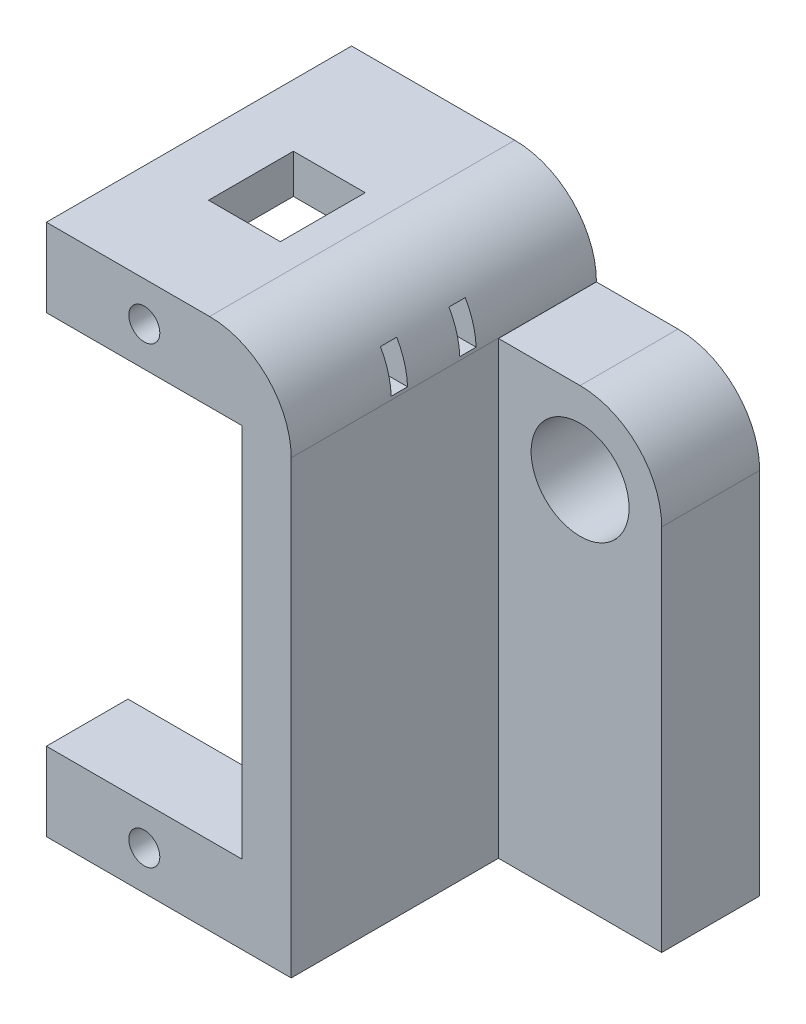
ISO-10303-21;
HEADER;
FILE_DESCRIPTION(('STEP AP214'),'2;1');
FILE_NAME('part.step','',(''),(''),'','','');
FILE_SCHEMA(('AUTOMOTIVE_DESIGN { 1 0 10303 214 1 1 1 1 }'));
ENDSEC;
DATA;
#1=APPLICATION_CONTEXT('core data for automotive mechanical design processes');
#2=APPLICATION_PROTOCOL_DEFINITION('international standard','automotive_design',2000,#1);
#3=PRODUCT_CONTEXT('',#1,'mechanical');
#4=PRODUCT('Part','Part','',(#3));
#5=PRODUCT_RELATED_PRODUCT_CATEGORY('part','',(#4));
#6=PRODUCT_DEFINITION_FORMATION('','',#4);
#7=PRODUCT_DEFINITION_CONTEXT('part definition',#1,'design');
#8=PRODUCT_DEFINITION('design','',#6,#7);
#9=PRODUCT_DEFINITION_SHAPE('','',#8);
#10=(LENGTH_UNIT() NAMED_UNIT(*) SI_UNIT(.MILLI.,.METRE.));
#11=(NAMED_UNIT(*) PLANE_ANGLE_UNIT() SI_UNIT($,.RADIAN.));
#12=(NAMED_UNIT(*) SI_UNIT($,.STERADIAN.) SOLID_ANGLE_UNIT());
#13=UNCERTAINTY_MEASURE_WITH_UNIT(LENGTH_MEASURE(1.E-05),#10,'distance_accuracy_value','');
#14=(GEOMETRIC_REPRESENTATION_CONTEXT(3) GLOBAL_UNCERTAINTY_ASSIGNED_CONTEXT((#13)) GLOBAL_UNIT_ASSIGNED_CONTEXT((#10,
#11,#12)) REPRESENTATION_CONTEXT('',''));
#15=CARTESIAN_POINT('',(0.,0.,0.));
#16=DIRECTION('',(0.,0.,1.));
#17=DIRECTION('',(1.,0.,0.));
#18=AXIS2_PLACEMENT_3D('',#15,#16,#17);
#19=CARTESIAN_POINT('',(19.0000000000061,0.,0.));
#20=DIRECTION('',(-1.,0.,0.));
#21=DIRECTION('',(0.,0.,1.));
#22=AXIS2_PLACEMENT_3D('',#19,#20,#21);
#23=PLANE('',#22);
#24=DIRECTION('',(0.,0.,1.));
#25=VECTOR('',#24,1.);
#26=CARTESIAN_POINT('',(19.0000000000061,-7.61690520008074,-19.7));
#27=LINE('',#26,#25);
#28=CARTESIAN_POINT('',(19.0000000000061,-7.61690520008074,-7.7));
#29=VERTEX_POINT('',#28);
#30=CARTESIAN_POINT('',(19.0000000000061,-7.61690520008077,-13.7));
#31=VERTEX_POINT('',#30);
#32=EDGE_CURVE('E49',#29,#31,#27,.F.);
#33=ORIENTED_EDGE('',*,*,#32,.F.);
#34=DIRECTION('',(0.,-1.,0.));
#35=VECTOR('',#34,1.);
#36=CARTESIAN_POINT('',(19.0000000000061,2.4000000000028,-7.7));
#37=LINE('',#36,#35);
#38=CARTESIAN_POINT('',(19.0000000000061,-30.1999999999972,-7.7));
#39=VERTEX_POINT('',#38);
#40=EDGE_CURVE('E440',#29,#39,#37,.T.);
#41=ORIENTED_EDGE('',*,*,#40,.T.);
#42=DIRECTION('',(0.,0.,-1.));
#43=VECTOR('',#42,1.);
#44=CARTESIAN_POINT('',(19.0000000000061,-30.1999999999972,-10.7));
#45=LINE('',#44,#43);
#46=CARTESIAN_POINT('',(19.0000000000061,-30.1999999999972,-13.7));
#47=VERTEX_POINT('',#46);
#48=EDGE_CURVE('E306',#39,#47,#45,.T.);
#49=ORIENTED_EDGE('',*,*,#48,.T.);
#50=DIRECTION('',(0.,-1.,0.));
#51=VECTOR('',#50,1.);
#52=CARTESIAN_POINT('',(19.0000000000061,-7.61690520008077,-13.7));
#53=LINE('',#52,#51);
#54=EDGE_CURVE('E304',#31,#47,#53,.T.);
#55=ORIENTED_EDGE('',*,*,#54,.F.);
#56=EDGE_LOOP('',(#33,#41,#49,#55));
#57=FACE_BOUND('',#56,.T.);
#58=ADVANCED_FACE('F41',(#57),#23,.F.);
#59=CARTESIAN_POINT('',(-5.99999999999394,2.4000000000028,0.));
#60=DIRECTION('',(0.,0.,-1.));
#61=DIRECTION('',(0.,1.,0.));
#62=AXIS2_PLACEMENT_3D('',#59,#60,#61);
#63=PLANE('',#62);
#64=DIRECTION('',(-1.,0.,0.));
#65=VECTOR('',#64,1.);
#66=CARTESIAN_POINT('',(6.00000000000606,0.,0.));
#67=LINE('',#66,#65);
#68=CARTESIAN_POINT('',(0.950000000000003,0.,0.));
#69=VERTEX_POINT('',#68);
#70=CARTESIAN_POINT('',(-0.950000000000003,0.,0.));
#71=VERTEX_POINT('',#70);
#72=EDGE_CURVE('E361',#69,#71,#67,.T.);
#73=ORIENTED_EDGE('',*,*,#72,.F.);
#74=CARTESIAN_POINT('',(0.,0.,0.));
#75=DIRECTION('',(0.,0.,1.));
#76=DIRECTION('',(1.,0.,0.));
#77=AXIS2_PLACEMENT_3D('',#74,#75,#76);
#78=CIRCLE('',#77,0.950000000000003);
#79=EDGE_CURVE('E269',#69,#71,#78,.T.);
#80=ORIENTED_EDGE('',*,*,#79,.T.);
#81=EDGE_LOOP('',(#73,#80));
#82=FACE_BOUND('',#81,.T.);
#83=ADVANCED_FACE('F494',(#82),#63,.F.);
#84=CARTESIAN_POINT('',(-2.2,-0.0999999999971974,-1.13455406858625));
#85=DIRECTION('',(0.,0.,1.));
#86=DIRECTION('',(1.,0.,0.));
#87=AXIS2_PLACEMENT_3D('',#84,#85,#86);
#88=PLANE('',#87);
#89=DIRECTION('',(0.,1.,0.));
#90=VECTOR('',#89,1.);
#91=CARTESIAN_POINT('',(2.2,-0.0999999999971974,-1.13455406858625));
#92=LINE('',#91,#90);
#93=CARTESIAN_POINT('',(2.2,0.,-1.13455406858625));
#94=VERTEX_POINT('',#93);
#95=CARTESIAN_POINT('',(2.2,2.4000000000028,-1.13455406858625));
#96=VERTEX_POINT('',#95);
#97=EDGE_CURVE('E429',#94,#96,#92,.T.);
#98=ORIENTED_EDGE('',*,*,#97,.F.);
#99=DIRECTION('',(-1.,0.,0.));
#100=VECTOR('',#99,1.);
#101=CARTESIAN_POINT('',(-2.2,0.,-1.13455406858625));
#102=LINE('',#101,#100);
#103=CARTESIAN_POINT('',(-2.2,0.,-1.13455406858625));
#104=VERTEX_POINT('',#103);
#105=EDGE_CURVE('E383',#94,#104,#102,.T.);
#106=ORIENTED_EDGE('',*,*,#105,.T.);
#107=DIRECTION('',(0.,1.,0.));
#108=VECTOR('',#107,1.);
#109=CARTESIAN_POINT('',(-2.2,-0.0999999999971974,-1.13455406858625));
#110=LINE('',#109,#108);
#111=CARTESIAN_POINT('',(-2.2,2.4000000000028,-1.13455406858625));
#112=VERTEX_POINT('',#111);
#113=EDGE_CURVE('E432',#104,#112,#110,.T.);
#114=ORIENTED_EDGE('',*,*,#113,.T.);
#115=DIRECTION('',(1.,0.,0.));
#116=VECTOR('',#115,1.);
#117=CARTESIAN_POINT('',(-2.2,2.4000000000028,-1.13455406858625));
#118=LINE('',#117,#116);
#119=EDGE_CURVE('E425',#112,#96,#118,.T.);
#120=ORIENTED_EDGE('',*,*,#119,.T.);
#121=EDGE_LOOP('',(#98,#106,#114,#120));
#122=FACE_BOUND('',#121,.T.);
#123=ADVANCED_FACE('F501',(#122),#88,.F.);
#124=CARTESIAN_POINT('',(-2.2,-0.0999999999971974,-6.33455406858625));
#125=DIRECTION('',(0.,0.,-1.));
#126=DIRECTION('',(-1.,0.,0.));
#127=AXIS2_PLACEMENT_3D('',#124,#125,#126);
#128=PLANE('',#127);
#129=DIRECTION('',(0.,1.,0.));
#130=VECTOR('',#129,1.);
#131=CARTESIAN_POINT('',(-2.2,-0.0999999999971974,-6.33455406858625));
#132=LINE('',#131,#130);
#133=CARTESIAN_POINT('',(-2.2,0.,-6.33455406858625));
#134=VERTEX_POINT('',#133);
#135=CARTESIAN_POINT('',(-2.2,2.4000000000028,-6.33455406858625));
#136=VERTEX_POINT('',#135);
#137=EDGE_CURVE('E434',#134,#136,#132,.T.);
#138=ORIENTED_EDGE('',*,*,#137,.F.);
#139=DIRECTION('',(1.,0.,0.));
#140=VECTOR('',#139,1.);
#141=CARTESIAN_POINT('',(-2.2,0.,-6.33455406858625));
#142=LINE('',#141,#140);
#143=CARTESIAN_POINT('',(2.2,0.,-6.33455406858625));
#144=VERTEX_POINT('',#143);
#145=EDGE_CURVE('E290',#134,#144,#142,.T.);
#146=ORIENTED_EDGE('',*,*,#145,.T.);
#147=DIRECTION('',(0.,1.,0.));
#148=VECTOR('',#147,1.);
#149=CARTESIAN_POINT('',(2.2,-0.0999999999971974,-6.33455406858625));
#150=LINE('',#149,#148);
#151=CARTESIAN_POINT('',(2.2,2.4000000000028,-6.33455406858625));
#152=VERTEX_POINT('',#151);
#153=EDGE_CURVE('E428',#144,#152,#150,.T.);
#154=ORIENTED_EDGE('',*,*,#153,.T.);
#155=DIRECTION('',(-1.,0.,0.));
#156=VECTOR('',#155,1.);
#157=CARTESIAN_POINT('',(-2.2,2.4000000000028,-6.33455406858625));
#158=LINE('',#157,#156);
#159=EDGE_CURVE('E419',#152,#136,#158,.T.);
#160=ORIENTED_EDGE('',*,*,#159,.T.);
#161=EDGE_LOOP('',(#138,#146,#154,#160));
#162=FACE_BOUND('',#161,.T.);
#163=ADVANCED_FACE('F603',(#162),#128,.F.);
#164=CARTESIAN_POINT('',(-5.99999999999394,-2.3999999999972,5.));
#165=DIRECTION('',(1.,0.,0.));
#166=DIRECTION('',(0.,0.,-1.));
#167=AXIS2_PLACEMENT_3D('',#164,#165,#166);
#168=PLANE('',#167);
#169=DIRECTION('',(0.,0.,-1.));
#170=VECTOR('',#169,1.);
#171=CARTESIAN_POINT('',(-5.99999999999394,2.4000000000028,5.));
#172=LINE('',#171,#170);
#173=CARTESIAN_POINT('',(-5.99999999999394,2.4000000000028,5.));
#174=VERTEX_POINT('',#173);
#175=CARTESIAN_POINT('',(-5.99999999999394,2.4000000000028,-13.7));
#176=VERTEX_POINT('',#175);
#177=EDGE_CURVE('E288',#174,#176,#172,.T.);
#178=ORIENTED_EDGE('',*,*,#177,.T.);
#179=DIRECTION('',(0.,1.,0.));
#180=VECTOR('',#179,1.);
#181=CARTESIAN_POINT('',(-5.99999999999394,0.,-13.7));
#182=LINE('',#181,#180);
#183=CARTESIAN_POINT('',(-5.99999999999394,0.,-13.7));
#184=VERTEX_POINT('',#183);
#185=EDGE_CURVE('E332',#184,#176,#182,.T.);
#186=ORIENTED_EDGE('',*,*,#185,.F.);
#187=DIRECTION('',(0.,0.,-1.));
#188=VECTOR('',#187,1.);
#189=CARTESIAN_POINT('',(-5.99999999999394,0.,-10.7));
#190=LINE('',#189,#188);
#191=CARTESIAN_POINT('',(-5.99999999999394,0.,0.));
#192=VERTEX_POINT('',#191);
#193=EDGE_CURVE('E352',#192,#184,#190,.T.);
#194=ORIENTED_EDGE('',*,*,#193,.F.);
#195=DIRECTION('',(0.,1.,0.));
#196=VECTOR('',#195,1.);
#197=CARTESIAN_POINT('',(-5.99999999999394,-2.3999999999972,0.));
#198=LINE('',#197,#196);
#199=CARTESIAN_POINT('',(-5.99999999999394,-2.3999999999972,0.));
#200=VERTEX_POINT('',#199);
#201=EDGE_CURVE('E346',#200,#192,#198,.T.);
#202=ORIENTED_EDGE('',*,*,#201,.F.);
#203=DIRECTION('',(0.,0.,-1.));
#204=VECTOR('',#203,1.);
#205=CARTESIAN_POINT('',(-5.99999999999394,-2.3999999999972,5.));
#206=LINE('',#205,#204);
#207=CARTESIAN_POINT('',(-5.99999999999394,-2.3999999999972,5.));
#208=VERTEX_POINT('',#207);
#209=EDGE_CURVE('E285',#208,#200,#206,.T.);
#210=ORIENTED_EDGE('',*,*,#209,.F.);
#211=DIRECTION('',(0.,-1.,0.));
#212=VECTOR('',#211,1.);
#213=CARTESIAN_POINT('',(-5.99999999999394,-2.3999999999972,5.));
#214=LINE('',#213,#212);
#215=EDGE_CURVE('E278',#174,#208,#214,.T.);
#216=ORIENTED_EDGE('',*,*,#215,.F.);
#217=EDGE_LOOP('',(#178,#186,#194,#202,#210,#216));
#218=FACE_BOUND('',#217,.T.);
#219=ADVANCED_FACE('F555',(#218),#168,.F.);
#220=CARTESIAN_POINT('',(6.00000000000606,-2.3999999999972,5.));
#221=DIRECTION('',(0.,1.,0.));
#222=DIRECTION('',(0.,0.,1.));
#223=AXIS2_PLACEMENT_3D('',#220,#221,#222);
#224=PLANE('',#223);
#225=ORIENTED_EDGE('',*,*,#209,.T.);
#226=DIRECTION('',(-1.,0.,0.));
#227=VECTOR('',#226,1.);
#228=CARTESIAN_POINT('',(6.00000000000606,-2.3999999999972,0.));
#229=LINE('',#228,#227);
#230=CARTESIAN_POINT('',(6.00000000000606,-2.3999999999972,0.));
#231=VERTEX_POINT('',#230);
#232=EDGE_CURVE('E354',#231,#200,#229,.T.);
#233=ORIENTED_EDGE('',*,*,#232,.F.);
#234=DIRECTION('',(0.,0.,-1.));
#235=VECTOR('',#234,1.);
#236=CARTESIAN_POINT('',(6.00000000000606,-2.3999999999972,5.));
#237=LINE('',#236,#235);
#238=CARTESIAN_POINT('',(6.00000000000606,-2.3999999999972,5.));
#239=VERTEX_POINT('',#238);
#240=EDGE_CURVE('E282',#239,#231,#237,.T.);
#241=ORIENTED_EDGE('',*,*,#240,.F.);
#242=DIRECTION('',(1.,0.,0.));
#243=VECTOR('',#242,1.);
#244=CARTESIAN_POINT('',(6.00000000000606,-2.3999999999972,5.));
#245=LINE('',#244,#243);
#246=EDGE_CURVE('E280',#208,#239,#245,.T.);
#247=ORIENTED_EDGE('',*,*,#246,.F.);
#248=EDGE_LOOP('',(#225,#233,#241,#247));
#249=FACE_BOUND('',#248,.T.);
#250=ADVANCED_FACE('F526',(#249),#224,.F.);
#251=CARTESIAN_POINT('',(9.00000000000606,0.,0.));
#252=DIRECTION('',(1.,0.,0.));
#253=DIRECTION('',(0.,0.,-1.));
#254=AXIS2_PLACEMENT_3D('',#251,#252,#253);
#255=PLANE('',#254);
#256=DIRECTION('',(0.,0.,1.));
#257=VECTOR('',#256,1.);
#258=CARTESIAN_POINT('',(9.00000000000605,-2.5999999999972,-18.));
#259=LINE('',#258,#257);
#260=CARTESIAN_POINT('',(9.00000000000606,-2.5999999999972,-13.7));
#261=VERTEX_POINT('',#260);
#262=CARTESIAN_POINT('',(9.00000000000605,-2.5999999999972,5.));
#263=VERTEX_POINT('',#262);
#264=EDGE_CURVE('E234',#261,#263,#259,.T.);
#265=ORIENTED_EDGE('',*,*,#264,.T.);
#266=DIRECTION('',(0.,-1.,0.));
#267=VECTOR('',#266,1.);
#268=CARTESIAN_POINT('',(9.00000000000606,2.4000000000028,5.));
#269=LINE('',#268,#267);
#270=CARTESIAN_POINT('',(9.00000000000606,-30.1999999999972,5.));
#271=VERTEX_POINT('',#270);
#272=EDGE_CURVE('E245',#263,#271,#269,.T.);
#273=ORIENTED_EDGE('',*,*,#272,.T.);
#274=DIRECTION('',(0.,0.,-1.));
#275=VECTOR('',#274,1.);
#276=CARTESIAN_POINT('',(9.00000000000606,-30.1999999999972,5.));
#277=LINE('',#276,#275);
#278=CARTESIAN_POINT('',(9.00000000000606,-30.1999999999972,-7.7));
#279=VERTEX_POINT('',#278);
#280=EDGE_CURVE('E255',#271,#279,#277,.T.);
#281=ORIENTED_EDGE('',*,*,#280,.T.);
#282=DIRECTION('',(0.,-1.,0.));
#283=VECTOR('',#282,1.);
#284=CARTESIAN_POINT('',(9.00000000000606,2.4000000000028,-7.7));
#285=LINE('',#284,#283);
#286=CARTESIAN_POINT('',(9.00000000000606,-2.61690520008074,-7.7));
#287=VERTEX_POINT('',#286);
#288=EDGE_CURVE('E439',#287,#279,#285,.T.);
#289=ORIENTED_EDGE('',*,*,#288,.F.);
#290=DIRECTION('',(0.,0.,1.));
#291=VECTOR('',#290,1.);
#292=CARTESIAN_POINT('',(9.00000000000606,-2.61690520008074,-19.7));
#293=LINE('',#292,#291);
#294=CARTESIAN_POINT('',(9.00000000000606,-2.61690520008074,-13.7));
#295=VERTEX_POINT('',#294);
#296=EDGE_CURVE('E343',#295,#287,#293,.T.);
#297=ORIENTED_EDGE('',*,*,#296,.F.);
#298=DIRECTION('',(0.,-1.,0.));
#299=VECTOR('',#298,1.);
#300=CARTESIAN_POINT('',(9.00000000000606,2.4000000000028,-13.7));
#301=LINE('',#300,#299);
#302=EDGE_CURVE('E248',#261,#295,#301,.T.);
#303=ORIENTED_EDGE('',*,*,#302,.F.);
#304=EDGE_LOOP('',(#265,#273,#281,#289,#297,#303));
#305=FACE_BOUND('',#304,.T.);
#306=ADVANCED_FACE('F243',(#305),#255,.T.);
#307=CARTESIAN_POINT('',(2.2,-0.0999999999971974,-6.33455406858625));
#308=DIRECTION('',(1.,0.,0.));
#309=DIRECTION('',(0.,0.,-1.));
#310=AXIS2_PLACEMENT_3D('',#307,#308,#309);
#311=PLANE('',#310);
#312=ORIENTED_EDGE('',*,*,#153,.F.);
#313=DIRECTION('',(0.,0.,1.));
#314=VECTOR('',#313,1.);
#315=CARTESIAN_POINT('',(2.2,0.,-6.33455406858625));
#316=LINE('',#315,#314);
#317=EDGE_CURVE('E380',#144,#94,#316,.T.);
#318=ORIENTED_EDGE('',*,*,#317,.T.);
#319=ORIENTED_EDGE('',*,*,#97,.T.);
#320=DIRECTION('',(0.,0.,-1.));
#321=VECTOR('',#320,1.);
#322=CARTESIAN_POINT('',(2.2,2.4000000000028,-6.33455406858625));
#323=LINE('',#322,#321);
#324=EDGE_CURVE('E416',#96,#152,#323,.T.);
#325=ORIENTED_EDGE('',*,*,#324,.T.);
#326=EDGE_LOOP('',(#312,#318,#319,#325));
#327=FACE_BOUND('',#326,.T.);
#328=ADVANCED_FACE('F525',(#327),#311,.F.);
#329=CARTESIAN_POINT('',(-2.2,-0.0999999999971974,-6.33455406858625));
#330=DIRECTION('',(-1.,0.,0.));
#331=DIRECTION('',(0.,0.,1.));
#332=AXIS2_PLACEMENT_3D('',#329,#330,#331);
#333=PLANE('',#332);
#334=ORIENTED_EDGE('',*,*,#113,.F.);
#335=DIRECTION('',(0.,0.,-1.));
#336=VECTOR('',#335,1.);
#337=CARTESIAN_POINT('',(-2.2,0.,-6.33455406858625));
#338=LINE('',#337,#336);
#339=EDGE_CURVE('E377',#104,#134,#338,.T.);
#340=ORIENTED_EDGE('',*,*,#339,.T.);
#341=ORIENTED_EDGE('',*,*,#137,.T.);
#342=DIRECTION('',(0.,0.,1.));
#343=VECTOR('',#342,1.);
#344=CARTESIAN_POINT('',(-2.2,2.4000000000028,-6.33455406858625));
#345=LINE('',#344,#343);
#346=EDGE_CURVE('E422',#136,#112,#345,.T.);
#347=ORIENTED_EDGE('',*,*,#346,.T.);
#348=EDGE_LOOP('',(#334,#340,#341,#347));
#349=FACE_BOUND('',#348,.T.);
#350=ADVANCED_FACE('F488',(#349),#333,.F.);
#351=CARTESIAN_POINT('',(6.00000000000606,0.,0.));
#352=DIRECTION('',(1.,0.,0.));
#353=DIRECTION('',(0.,0.,-1.));
#354=AXIS2_PLACEMENT_3D('',#351,#352,#353);
#355=PLANE('',#354);
#356=ORIENTED_EDGE('',*,*,#240,.T.);
#357=DIRECTION('',(0.,1.,0.));
#358=VECTOR('',#357,1.);
#359=CARTESIAN_POINT('',(6.00000000000606,-2.3999999999972,0.));
#360=LINE('',#359,#358);
#361=CARTESIAN_POINT('',(6.00000000000606,0.,0.));
#362=VERTEX_POINT('',#361);
#363=EDGE_CURVE('E348',#231,#362,#360,.T.);
#364=ORIENTED_EDGE('',*,*,#363,.T.);
#365=DIRECTION('',(0.,0.,-1.));
#366=VECTOR('',#365,1.);
#367=CARTESIAN_POINT('',(6.00000000000606,0.,-10.7));
#368=LINE('',#367,#366);
#369=CARTESIAN_POINT('',(6.00000000000606,0.,-13.7));
#370=VERTEX_POINT('',#369);
#371=EDGE_CURVE('E351',#362,#370,#368,.T.);
#372=ORIENTED_EDGE('',*,*,#371,.T.);
#373=DIRECTION('',(0.,1.,0.));
#374=VECTOR('',#373,1.);
#375=CARTESIAN_POINT('',(6.00000000000606,-30.1999999999972,-13.7));
#376=LINE('',#375,#374);
#377=CARTESIAN_POINT('',(6.00000000000606,-30.1999999999972,-13.7));
#378=VERTEX_POINT('',#377);
#379=EDGE_CURVE('E326',#378,#370,#376,.T.);
#380=ORIENTED_EDGE('',*,*,#379,.F.);
#381=DIRECTION('',(0.,0.,-1.));
#382=VECTOR('',#381,1.);
#383=CARTESIAN_POINT('',(6.00000000000606,-30.1999999999972,5.));
#384=LINE('',#383,#382);
#385=CARTESIAN_POINT('',(6.00000000000606,-30.1999999999972,0.));
#386=VERTEX_POINT('',#385);
#387=EDGE_CURVE('E256',#386,#378,#384,.T.);
#388=ORIENTED_EDGE('',*,*,#387,.F.);
#389=DIRECTION('',(0.,1.,0.));
#390=VECTOR('',#389,1.);
#391=CARTESIAN_POINT('',(6.00000000000606,-30.1999999999972,0.));
#392=LINE('',#391,#390);
#393=CARTESIAN_POINT('',(6.00000000000606,-25.3999999999972,0.));
#394=VERTEX_POINT('',#393);
#395=EDGE_CURVE('E465',#386,#394,#392,.T.);
#396=ORIENTED_EDGE('',*,*,#395,.T.);
#397=DIRECTION('',(0.,0.,-1.));
#398=VECTOR('',#397,1.);
#399=CARTESIAN_POINT('',(6.00000000000606,-25.3999999999972,5.));
#400=LINE('',#399,#398);
#401=CARTESIAN_POINT('',(6.00000000000606,-25.3999999999972,5.));
#402=VERTEX_POINT('',#401);
#403=EDGE_CURVE('E447',#402,#394,#400,.T.);
#404=ORIENTED_EDGE('',*,*,#403,.F.);
#405=DIRECTION('',(0.,-1.,0.));
#406=VECTOR('',#405,1.);
#407=CARTESIAN_POINT('',(6.00000000000606,2.4000000000028,5.));
#408=LINE('',#407,#406);
#409=EDGE_CURVE('E259',#239,#402,#408,.T.);
#410=ORIENTED_EDGE('',*,*,#409,.F.);
#411=EDGE_LOOP('',(#356,#364,#372,#380,#388,#396,#404,#410));
#412=FACE_BOUND('',#411,.T.);
#413=DIRECTION('',(0.,1.,0.));
#414=VECTOR('',#413,1.);
#415=CARTESIAN_POINT('',(6.00000000000606,-2.5999999999972,-5.33455406858625));
#416=LINE('',#415,#414);
#417=CARTESIAN_POINT('',(6.00000000000606,-2.3999999999972,-5.33455406858625));
#418=VERTEX_POINT('',#417);
#419=CARTESIAN_POINT('',(6.00000000000606,-0.0999999999971974,-5.33455406858625));
#420=VERTEX_POINT('',#419);
#421=EDGE_CURVE('E365',#418,#420,#416,.T.);
#422=ORIENTED_EDGE('',*,*,#421,.F.);
#423=DIRECTION('',(0.,0.,1.));
#424=VECTOR('',#423,1.);
#425=CARTESIAN_POINT('',(6.00000000000606,-2.3999999999972,0.));
#426=LINE('',#425,#424);
#427=CARTESIAN_POINT('',(6.00000000000606,-2.3999999999972,-6.33455406858625));
#428=VERTEX_POINT('',#427);
#429=EDGE_CURVE('E399',#428,#418,#426,.T.);
#430=ORIENTED_EDGE('',*,*,#429,.F.);
#431=DIRECTION('',(0.,-1.,0.));
#432=VECTOR('',#431,1.);
#433=CARTESIAN_POINT('',(6.00000000000606,-0.0999999999971974,-6.33455406858625));
#434=LINE('',#433,#432);
#435=CARTESIAN_POINT('',(6.00000000000606,-0.0999999999971974,-6.33455406858625));
#436=VERTEX_POINT('',#435);
#437=EDGE_CURVE('E368',#436,#428,#434,.T.);
#438=ORIENTED_EDGE('',*,*,#437,.F.);
#439=DIRECTION('',(0.,0.,1.));
#440=VECTOR('',#439,1.);
#441=CARTESIAN_POINT('',(6.00000000000606,-0.0999999999971974,-5.33455406858625));
#442=LINE('',#441,#440);
#443=EDGE_CURVE('E360',#436,#420,#442,.T.);
#444=ORIENTED_EDGE('',*,*,#443,.T.);
#445=EDGE_LOOP('',(#422,#430,#438,#444));
#446=FACE_BOUND('',#445,.T.);
#447=DIRECTION('',(0.,1.,0.));
#448=VECTOR('',#447,1.);
#449=CARTESIAN_POINT('',(6.00000000000606,-0.0999999999971974,-1.13455406858625));
#450=LINE('',#449,#448);
#451=CARTESIAN_POINT('',(6.00000000000606,-2.3999999999972,-1.13455406858625));
#452=VERTEX_POINT('',#451);
#453=CARTESIAN_POINT('',(6.00000000000606,-0.0999999999971974,-1.13455406858625));
#454=VERTEX_POINT('',#453);
#455=EDGE_CURVE('E374',#452,#454,#450,.T.);
#456=ORIENTED_EDGE('',*,*,#455,.F.);
#457=DIRECTION('',(0.,0.,1.));
#458=VECTOR('',#457,1.);
#459=CARTESIAN_POINT('',(6.00000000000606,-2.3999999999972,0.));
#460=LINE('',#459,#458);
#461=CARTESIAN_POINT('',(6.00000000000606,-2.3999999999972,-2.13455406858625));
#462=VERTEX_POINT('',#461);
#463=EDGE_CURVE('E413',#462,#452,#460,.T.);
#464=ORIENTED_EDGE('',*,*,#463,.F.);
#465=DIRECTION('',(0.,-1.,0.));
#466=VECTOR('',#465,1.);
#467=CARTESIAN_POINT('',(6.00000000000606,-2.5999999999972,-2.13455406858625));
#468=LINE('',#467,#466);
#469=CARTESIAN_POINT('',(6.00000000000606,-0.0999999999971974,-2.13455406858625));
#470=VERTEX_POINT('',#469);
#471=EDGE_CURVE('E372',#470,#462,#468,.T.);
#472=ORIENTED_EDGE('',*,*,#471,.F.);
#473=DIRECTION('',(0.,0.,1.));
#474=VECTOR('',#473,1.);
#475=CARTESIAN_POINT('',(6.00000000000606,-0.0999999999971974,-2.13455406858625));
#476=LINE('',#475,#474);
#477=EDGE_CURVE('E370',#470,#454,#476,.T.);
#478=ORIENTED_EDGE('',*,*,#477,.T.);
#479=EDGE_LOOP('',(#456,#464,#472,#478));
#480=FACE_BOUND('',#479,.T.);
#481=ADVANCED_FACE('F479',(#412,#446,#480),#355,.F.);
#482=CARTESIAN_POINT('',(0.,0.,5.));
#483=DIRECTION('',(0.,0.,1.));
#484=DIRECTION('',(1.,0.,0.));
#485=AXIS2_PLACEMENT_3D('',#482,#483,#484);
#486=PLANE('',#485);
#487=CARTESIAN_POINT('',(4.00000000000605,-2.5999999999972,5.));
#488=DIRECTION('',(0.,0.,-1.));
#489=DIRECTION('',(-1.,0.,0.));
#490=AXIS2_PLACEMENT_3D('',#487,#488,#489);
#491=CIRCLE('',#490,5.);
#492=CARTESIAN_POINT('',(4.00000000000605,2.4000000000028,5.));
#493=VERTEX_POINT('',#492);
#494=EDGE_CURVE('E231',#493,#263,#491,.T.);
#495=ORIENTED_EDGE('',*,*,#494,.F.);
#496=DIRECTION('',(-1.,0.,0.));
#497=VECTOR('',#496,1.);
#498=CARTESIAN_POINT('',(6.00000000000606,2.4000000000028,5.));
#499=LINE('',#498,#497);
#500=EDGE_CURVE('E273',#493,#174,#499,.T.);
#501=ORIENTED_EDGE('',*,*,#500,.T.);
#502=ORIENTED_EDGE('',*,*,#215,.T.);
#503=ORIENTED_EDGE('',*,*,#246,.T.);
#504=ORIENTED_EDGE('',*,*,#409,.T.);
#505=DIRECTION('',(-1.,0.,0.));
#506=VECTOR('',#505,1.);
#507=CARTESIAN_POINT('',(6.00000000000606,-25.3999999999972,5.));
#508=LINE('',#507,#506);
#509=CARTESIAN_POINT('',(-5.99999999999394,-25.3999999999972,5.));
#510=VERTEX_POINT('',#509);
#511=EDGE_CURVE('E461',#402,#510,#508,.T.);
#512=ORIENTED_EDGE('',*,*,#511,.T.);
#513=DIRECTION('',(0.,-1.,0.));
#514=VECTOR('',#513,1.);
#515=CARTESIAN_POINT('',(-5.99999999999394,-30.1999999999972,5.));
#516=LINE('',#515,#514);
#517=CARTESIAN_POINT('',(-5.99999999999394,-30.1999999999972,5.));
#518=VERTEX_POINT('',#517);
#519=EDGE_CURVE('E456',#510,#518,#516,.T.);
#520=ORIENTED_EDGE('',*,*,#519,.T.);
#521=DIRECTION('',(-1.,0.,0.));
#522=VECTOR('',#521,1.);
#523=CARTESIAN_POINT('',(9.00000000000606,-30.1999999999972,5.));
#524=LINE('',#523,#522);
#525=EDGE_CURVE('E254',#271,#518,#524,.T.);
#526=ORIENTED_EDGE('',*,*,#525,.F.);
#527=ORIENTED_EDGE('',*,*,#272,.F.);
#528=EDGE_LOOP('',(#495,#501,#502,#503,#504,#512,#520,#526,#527));
#529=FACE_BOUND('',#528,.T.);
#530=CARTESIAN_POINT('',(0.,0.,5.));
#531=DIRECTION('',(0.,0.,1.));
#532=DIRECTION('',(1.,0.,0.));
#533=AXIS2_PLACEMENT_3D('',#530,#531,#532);
#534=CIRCLE('',#533,0.950000000000003);
#535=CARTESIAN_POINT('',(0.950000000000003,0.,5.));
#536=VERTEX_POINT('',#535);
#537=EDGE_CURVE('E270',#536,#536,#534,.T.);
#538=ORIENTED_EDGE('',*,*,#537,.F.);
#539=EDGE_LOOP('',(#538));
#540=FACE_BOUND('',#539,.T.);
#541=CARTESIAN_POINT('',(0.,-27.7999999999925,5.));
#542=DIRECTION('',(0.,0.,1.));
#543=DIRECTION('',(1.,0.,0.));
#544=AXIS2_PLACEMENT_3D('',#541,#542,#543);
#545=CIRCLE('',#544,0.950000000000002);
#546=CARTESIAN_POINT('',(0.950000000000002,-27.7999999999925,5.));
#547=VERTEX_POINT('',#546);
#548=EDGE_CURVE('E262',#547,#547,#545,.T.);
#549=ORIENTED_EDGE('',*,*,#548,.F.);
#550=EDGE_LOOP('',(#549));
#551=FACE_BOUND('',#550,.T.);
#552=ADVANCED_FACE('F251',(#529,#540,#551),#486,.T.);
#553=CARTESIAN_POINT('',(6.00000000000606,2.4000000000028,5.));
#554=DIRECTION('',(0.,-1.,0.));
#555=DIRECTION('',(0.,0.,-1.));
#556=AXIS2_PLACEMENT_3D('',#553,#554,#555);
#557=PLANE('',#556);
#558=ORIENTED_EDGE('',*,*,#159,.F.);
#559=ORIENTED_EDGE('',*,*,#324,.F.);
#560=ORIENTED_EDGE('',*,*,#119,.F.);
#561=ORIENTED_EDGE('',*,*,#346,.F.);
#562=EDGE_LOOP('',(#558,#559,#560,#561));
#563=FACE_BOUND('',#562,.T.);
#564=ORIENTED_EDGE('',*,*,#500,.F.);
#565=DIRECTION('',(0.,0.,1.));
#566=VECTOR('',#565,1.);
#567=CARTESIAN_POINT('',(4.00000000000605,2.4000000000028,-18.));
#568=LINE('',#567,#566);
#569=CARTESIAN_POINT('',(4.00000000000605,2.4000000000028,-13.7));
#570=VERTEX_POINT('',#569);
#571=EDGE_CURVE('E236',#570,#493,#568,.T.);
#572=ORIENTED_EDGE('',*,*,#571,.F.);
#573=DIRECTION('',(1.,0.,0.));
#574=VECTOR('',#573,1.);
#575=CARTESIAN_POINT('',(-5.99999999999394,2.4000000000028,-13.7));
#576=LINE('',#575,#574);
#577=EDGE_CURVE('E335',#176,#570,#576,.T.);
#578=ORIENTED_EDGE('',*,*,#577,.F.);
#579=ORIENTED_EDGE('',*,*,#177,.F.);
#580=EDGE_LOOP('',(#564,#572,#578,#579));
#581=FACE_BOUND('',#580,.T.);
#582=ADVANCED_FACE('F43',(#563,#581),#557,.F.);
#583=CARTESIAN_POINT('',(0.,0.,5.));
#584=DIRECTION('',(0.,0.,-1.));
#585=DIRECTION('',(-1.,0.,0.));
#586=AXIS2_PLACEMENT_3D('',#583,#584,#585);
#587=CYLINDRICAL_SURFACE('',#586,0.950000000000003);
#588=ORIENTED_EDGE('',*,*,#537,.T.);
#589=EDGE_LOOP('',(#588));
#590=FACE_BOUND('',#589,.T.);
#591=ORIENTED_EDGE('',*,*,#79,.F.);
#592=EDGE_CURVE('E276',#71,#69,#78,.T.);
#593=ORIENTED_EDGE('',*,*,#592,.F.);
#594=EDGE_LOOP('',(#591,#593));
#595=FACE_BOUND('',#594,.T.);
#596=ADVANCED_FACE('F485',(#590,#595),#587,.F.);
#597=CARTESIAN_POINT('',(9.00000000000606,-30.1999999999972,5.));
#598=DIRECTION('',(0.,1.,0.));
#599=DIRECTION('',(0.,0.,1.));
#600=AXIS2_PLACEMENT_3D('',#597,#598,#599);
#601=PLANE('',#600);
#602=ORIENTED_EDGE('',*,*,#525,.T.);
#603=DIRECTION('',(0.,0.,-1.));
#604=VECTOR('',#603,1.);
#605=CARTESIAN_POINT('',(-5.99999999999394,-30.1999999999972,5.));
#606=LINE('',#605,#604);
#607=CARTESIAN_POINT('',(-5.99999999999394,-30.1999999999972,0.));
#608=VERTEX_POINT('',#607);
#609=EDGE_CURVE('E453',#518,#608,#606,.T.);
#610=ORIENTED_EDGE('',*,*,#609,.T.);
#611=DIRECTION('',(1.,0.,0.));
#612=VECTOR('',#611,1.);
#613=CARTESIAN_POINT('',(6.00000000000606,-30.1999999999972,0.));
#614=LINE('',#613,#612);
#615=EDGE_CURVE('E457',#608,#386,#614,.T.);
#616=ORIENTED_EDGE('',*,*,#615,.T.);
#617=ORIENTED_EDGE('',*,*,#387,.T.);
#618=DIRECTION('',(-1.,0.,0.));
#619=VECTOR('',#618,1.);
#620=CARTESIAN_POINT('',(19.0000000000061,-30.1999999999972,-13.7));
#621=LINE('',#620,#619);
#622=EDGE_CURVE('E310',#47,#378,#621,.T.);
#623=ORIENTED_EDGE('',*,*,#622,.F.);
#624=ORIENTED_EDGE('',*,*,#48,.F.);
#625=DIRECTION('',(-1.,0.,0.));
#626=VECTOR('',#625,1.);
#627=CARTESIAN_POINT('',(19.0000000000061,-30.1999999999972,-7.7));
#628=LINE('',#627,#626);
#629=EDGE_CURVE('E443',#39,#279,#628,.T.);
#630=ORIENTED_EDGE('',*,*,#629,.T.);
#631=ORIENTED_EDGE('',*,*,#280,.F.);
#632=EDGE_LOOP('',(#602,#610,#616,#617,#623,#624,#630,#631));
#633=FACE_BOUND('',#632,.T.);
#634=ADVANCED_FACE('F521',(#633),#601,.F.);
#635=CARTESIAN_POINT('',(0.,0.,0.));
#636=DIRECTION('',(0.,0.,1.));
#637=DIRECTION('',(1.,0.,0.));
#638=AXIS2_PLACEMENT_3D('',#635,#636,#637);
#639=PLANE('',#638);
#640=ORIENTED_EDGE('',*,*,#395,.F.);
#641=ORIENTED_EDGE('',*,*,#615,.F.);
#642=DIRECTION('',(0.,-1.,0.));
#643=VECTOR('',#642,1.);
#644=CARTESIAN_POINT('',(-5.99999999999394,-30.1999999999972,0.));
#645=LINE('',#644,#643);
#646=CARTESIAN_POINT('',(-5.99999999999394,-25.3999999999972,0.));
#647=VERTEX_POINT('',#646);
#648=EDGE_CURVE('E460',#647,#608,#645,.T.);
#649=ORIENTED_EDGE('',*,*,#648,.F.);
#650=DIRECTION('',(-1.,0.,0.));
#651=VECTOR('',#650,1.);
#652=CARTESIAN_POINT('',(6.00000000000606,-25.3999999999972,0.));
#653=LINE('',#652,#651);
#654=EDGE_CURVE('E463',#394,#647,#653,.T.);
#655=ORIENTED_EDGE('',*,*,#654,.F.);
#656=EDGE_LOOP('',(#640,#641,#649,#655));
#657=FACE_BOUND('',#656,.T.);
#658=CARTESIAN_POINT('',(0.,-27.7999999999925,0.));
#659=DIRECTION('',(0.,0.,1.));
#660=DIRECTION('',(1.,0.,0.));
#661=AXIS2_PLACEMENT_3D('',#658,#659,#660);
#662=CIRCLE('',#661,0.950000000000002);
#663=CARTESIAN_POINT('',(0.950000000000002,-27.7999999999925,0.));
#664=VERTEX_POINT('',#663);
#665=EDGE_CURVE('E266',#664,#664,#662,.T.);
#666=ORIENTED_EDGE('',*,*,#665,.T.);
#667=EDGE_LOOP('',(#666));
#668=FACE_BOUND('',#667,.T.);
#669=ADVANCED_FACE('F514',(#657,#668),#639,.F.);
#670=CARTESIAN_POINT('',(6.00000000000606,-25.3999999999972,5.));
#671=DIRECTION('',(0.,-1.,0.));
#672=DIRECTION('',(0.,0.,-1.));
#673=AXIS2_PLACEMENT_3D('',#670,#671,#672);
#674=PLANE('',#673);
#675=ORIENTED_EDGE('',*,*,#654,.T.);
#676=DIRECTION('',(0.,0.,-1.));
#677=VECTOR('',#676,1.);
#678=CARTESIAN_POINT('',(-5.99999999999394,-25.3999999999972,5.));
#679=LINE('',#678,#677);
#680=EDGE_CURVE('E450',#510,#647,#679,.T.);
#681=ORIENTED_EDGE('',*,*,#680,.F.);
#682=ORIENTED_EDGE('',*,*,#511,.F.);
#683=ORIENTED_EDGE('',*,*,#403,.T.);
#684=EDGE_LOOP('',(#675,#681,#682,#683));
#685=FACE_BOUND('',#684,.T.);
#686=ADVANCED_FACE('F510',(#685),#674,.F.);
#687=CARTESIAN_POINT('',(-5.99999999999394,-30.1999999999972,5.));
#688=DIRECTION('',(1.,0.,0.));
#689=DIRECTION('',(0.,0.,-1.));
#690=AXIS2_PLACEMENT_3D('',#687,#688,#689);
#691=PLANE('',#690);
#692=ORIENTED_EDGE('',*,*,#648,.T.);
#693=ORIENTED_EDGE('',*,*,#609,.F.);
#694=ORIENTED_EDGE('',*,*,#519,.F.);
#695=ORIENTED_EDGE('',*,*,#680,.T.);
#696=EDGE_LOOP('',(#692,#693,#694,#695));
#697=FACE_BOUND('',#696,.T.);
#698=ADVANCED_FACE('F513',(#697),#691,.F.);
#699=CARTESIAN_POINT('',(0.,-27.7999999999925,5.));
#700=DIRECTION('',(0.,0.,-1.));
#701=DIRECTION('',(-1.,0.,0.));
#702=AXIS2_PLACEMENT_3D('',#699,#700,#701);
#703=CYLINDRICAL_SURFACE('',#702,0.950000000000002);
#704=ORIENTED_EDGE('',*,*,#548,.T.);
#705=EDGE_LOOP('',(#704));
#706=FACE_BOUND('',#705,.T.);
#707=ORIENTED_EDGE('',*,*,#665,.F.);
#708=EDGE_LOOP('',(#707));
#709=FACE_BOUND('',#708,.T.);
#710=ADVANCED_FACE('F475',(#706,#709),#703,.F.);
#711=CARTESIAN_POINT('',(19.0000000000061,2.4000000000028,-7.7));
#712=DIRECTION('',(0.,0.,-1.));
#713=DIRECTION('',(0.,1.,0.));
#714=AXIS2_PLACEMENT_3D('',#711,#712,#713);
#715=PLANE('',#714);
#716=CARTESIAN_POINT('',(14.0000000000061,-7.61690520008074,-7.7));
#717=DIRECTION('',(0.,0.,1.));
#718=DIRECTION('',(1.,0.,0.));
#719=AXIS2_PLACEMENT_3D('',#716,#717,#718);
#720=CIRCLE('',#719,3.);
#721=CARTESIAN_POINT('',(17.0000000000061,-7.61690520008074,-7.7));
#722=VERTEX_POINT('',#721);
#723=EDGE_CURVE('E431',#722,#722,#720,.T.);
#724=ORIENTED_EDGE('',*,*,#723,.F.);
#725=EDGE_LOOP('',(#724));
#726=FACE_BOUND('',#725,.T.);
#727=ORIENTED_EDGE('',*,*,#40,.F.);
#728=CARTESIAN_POINT('',(14.0000000000061,-7.61690520008074,-7.7));
#729=DIRECTION('',(0.,0.,-1.));
#730=DIRECTION('',(1.,0.,0.));
#731=AXIS2_PLACEMENT_3D('',#728,#729,#730);
#732=CIRCLE('',#731,5.);
#733=CARTESIAN_POINT('',(14.0000000000061,-2.61690520008074,-7.7));
#734=VERTEX_POINT('',#733);
#735=EDGE_CURVE('E300',#734,#29,#732,.T.);
#736=ORIENTED_EDGE('',*,*,#735,.F.);
#737=DIRECTION('',(1.,0.,0.));
#738=VECTOR('',#737,1.);
#739=CARTESIAN_POINT('',(14.0000000000061,-2.61690520008074,-7.7));
#740=LINE('',#739,#738);
#741=EDGE_CURVE('E340',#287,#734,#740,.T.);
#742=ORIENTED_EDGE('',*,*,#741,.F.);
#743=ORIENTED_EDGE('',*,*,#288,.T.);
#744=ORIENTED_EDGE('',*,*,#629,.F.);
#745=EDGE_LOOP('',(#727,#736,#742,#743,#744));
#746=FACE_BOUND('',#745,.T.);
#747=ADVANCED_FACE('F507',(#726,#746),#715,.F.);
#748=CARTESIAN_POINT('',(14.0000000000061,-7.61690520008074,-10.7));
#749=DIRECTION('',(0.,0.,1.));
#750=DIRECTION('',(1.,0.,0.));
#751=AXIS2_PLACEMENT_3D('',#748,#749,#750);
#752=CYLINDRICAL_SURFACE('',#751,3.);
#753=ORIENTED_EDGE('',*,*,#723,.T.);
#754=EDGE_LOOP('',(#753));
#755=FACE_BOUND('',#754,.T.);
#756=CARTESIAN_POINT('',(14.0000000000061,-7.61690520008074,-13.7));
#757=DIRECTION('',(0.,0.,-1.));
#758=DIRECTION('',(0.,1.,0.));
#759=AXIS2_PLACEMENT_3D('',#756,#757,#758);
#760=CIRCLE('',#759,3.);
#761=CARTESIAN_POINT('',(14.0000000000061,-4.61690520008073,-13.7));
#762=VERTEX_POINT('',#761);
#763=EDGE_CURVE('E318',#762,#762,#760,.T.);
#764=ORIENTED_EDGE('',*,*,#763,.T.);
#765=EDGE_LOOP('',(#764));
#766=FACE_BOUND('',#765,.T.);
#767=ADVANCED_FACE('F506',(#755,#766),#752,.F.);
#768=DIRECTION('',(1.,0.,0.));
#769=VECTOR('',#768,1.);
#770=CARTESIAN_POINT('',(-10.3,-0.0999999999971974,-1.13455406858625));
#771=LINE('',#770,#769);
#772=CARTESIAN_POINT('',(8.33012701892825,-0.0999999999971974,-1.13455406858625));
#773=VERTEX_POINT('',#772);
#774=EDGE_CURVE('E406',#454,#773,#771,.T.);
#775=ORIENTED_EDGE('',*,*,#774,.T.);
#776=CARTESIAN_POINT('',(4.00000000000605,-2.5999999999972,-1.13455406858625));
#777=DIRECTION('',(0.,0.,1.));
#778=DIRECTION('',(1.,0.,0.));
#779=AXIS2_PLACEMENT_3D('',#776,#777,#778);
#780=CIRCLE('',#779,5.);
#781=CARTESIAN_POINT('',(8.99599839872477,-2.3999999999972,-1.13455406858625));
#782=VERTEX_POINT('',#781);
#783=EDGE_CURVE('E56',#773,#782,#780,.F.);
#784=ORIENTED_EDGE('',*,*,#783,.T.);
#785=DIRECTION('',(1.,0.,0.));
#786=VECTOR('',#785,1.);
#787=CARTESIAN_POINT('',(-10.3,-2.3999999999972,-1.13455406858625));
#788=LINE('',#787,#786);
#789=EDGE_CURVE('E403',#452,#782,#788,.T.);
#790=ORIENTED_EDGE('',*,*,#789,.F.);
#791=ORIENTED_EDGE('',*,*,#455,.T.);
#792=EDGE_LOOP('',(#775,#784,#790,#791));
#793=FACE_BOUND('',#792,.T.);
#794=ADVANCED_FACE('F580',(#793),#88,.F.);
#795=DIRECTION('',(1.,0.,0.));
#796=VECTOR('',#795,1.);
#797=CARTESIAN_POINT('',(-10.3,-2.3999999999972,-6.33455406858625));
#798=LINE('',#797,#796);
#799=CARTESIAN_POINT('',(8.99599839872478,-2.3999999999972,-6.33455406858625));
#800=VERTEX_POINT('',#799);
#801=EDGE_CURVE('E389',#428,#800,#798,.T.);
#802=ORIENTED_EDGE('',*,*,#801,.T.);
#803=CARTESIAN_POINT('',(4.00000000000605,-2.5999999999972,-6.33455406858625));
#804=DIRECTION('',(0.,0.,-1.));
#805=DIRECTION('',(-1.,0.,0.));
#806=AXIS2_PLACEMENT_3D('',#803,#804,#805);
#807=CIRCLE('',#806,5.);
#808=CARTESIAN_POINT('',(8.33012701892825,-0.0999999999971974,-6.33455406858625));
#809=VERTEX_POINT('',#808);
#810=EDGE_CURVE('E64',#800,#809,#807,.F.);
#811=ORIENTED_EDGE('',*,*,#810,.T.);
#812=DIRECTION('',(1.,0.,0.));
#813=VECTOR('',#812,1.);
#814=CARTESIAN_POINT('',(-10.3,-0.0999999999971974,-6.33455406858625));
#815=LINE('',#814,#813);
#816=EDGE_CURVE('E393',#436,#809,#815,.T.);
#817=ORIENTED_EDGE('',*,*,#816,.F.);
#818=ORIENTED_EDGE('',*,*,#437,.T.);
#819=EDGE_LOOP('',(#802,#811,#817,#818));
#820=FACE_BOUND('',#819,.T.);
#821=ADVANCED_FACE('F593',(#820),#128,.F.);
#822=CARTESIAN_POINT('',(-2.2,-2.5999999999972,-2.13455406858625));
#823=DIRECTION('',(0.,0.,-1.));
#824=DIRECTION('',(-1.,0.,0.));
#825=AXIS2_PLACEMENT_3D('',#822,#823,#824);
#826=PLANE('',#825);
#827=DIRECTION('',(1.,0.,0.));
#828=VECTOR('',#827,1.);
#829=CARTESIAN_POINT('',(-10.3,-2.3999999999972,-2.13455406858625));
#830=LINE('',#829,#828);
#831=CARTESIAN_POINT('',(8.99599839872477,-2.3999999999972,-2.13455406858625));
#832=VERTEX_POINT('',#831);
#833=EDGE_CURVE('E400',#462,#832,#830,.T.);
#834=ORIENTED_EDGE('',*,*,#833,.T.);
#835=CARTESIAN_POINT('',(4.00000000000605,-2.5999999999972,-2.13455406858625));
#836=DIRECTION('',(0.,0.,-1.));
#837=DIRECTION('',(-1.,0.,0.));
#838=AXIS2_PLACEMENT_3D('',#835,#836,#837);
#839=CIRCLE('',#838,5.);
#840=CARTESIAN_POINT('',(8.33012701892825,-0.0999999999971974,-2.13455406858625));
#841=VERTEX_POINT('',#840);
#842=EDGE_CURVE('E572',#832,#841,#839,.F.);
#843=ORIENTED_EDGE('',*,*,#842,.T.);
#844=DIRECTION('',(1.,0.,0.));
#845=VECTOR('',#844,1.);
#846=CARTESIAN_POINT('',(-10.3,-0.0999999999971974,-2.13455406858625));
#847=LINE('',#846,#845);
#848=EDGE_CURVE('E390',#470,#841,#847,.T.);
#849=ORIENTED_EDGE('',*,*,#848,.F.);
#850=ORIENTED_EDGE('',*,*,#471,.T.);
#851=EDGE_LOOP('',(#834,#843,#849,#850));
#852=FACE_BOUND('',#851,.T.);
#853=ADVANCED_FACE('F590',(#852),#826,.F.);
#854=CARTESIAN_POINT('',(-2.2,-2.5999999999972,-5.33455406858625));
#855=DIRECTION('',(0.,0.,1.));
#856=DIRECTION('',(1.,0.,0.));
#857=AXIS2_PLACEMENT_3D('',#854,#855,#856);
#858=PLANE('',#857);
#859=DIRECTION('',(1.,0.,0.));
#860=VECTOR('',#859,1.);
#861=CARTESIAN_POINT('',(-10.3,-0.0999999999971974,-5.33455406858625));
#862=LINE('',#861,#860);
#863=CARTESIAN_POINT('',(8.33012701892825,-0.0999999999971974,-5.33455406858625));
#864=VERTEX_POINT('',#863);
#865=EDGE_CURVE('E396',#420,#864,#862,.T.);
#866=ORIENTED_EDGE('',*,*,#865,.T.);
#867=CARTESIAN_POINT('',(4.00000000000605,-2.5999999999972,-5.33455406858625));
#868=DIRECTION('',(0.,0.,1.));
#869=DIRECTION('',(1.,0.,0.));
#870=AXIS2_PLACEMENT_3D('',#867,#868,#869);
#871=CIRCLE('',#870,5.);
#872=CARTESIAN_POINT('',(8.99599839872477,-2.3999999999972,-5.33455406858625));
#873=VERTEX_POINT('',#872);
#874=EDGE_CURVE('E562',#864,#873,#871,.F.);
#875=ORIENTED_EDGE('',*,*,#874,.T.);
#876=DIRECTION('',(1.,0.,0.));
#877=VECTOR('',#876,1.);
#878=CARTESIAN_POINT('',(-10.3,-2.3999999999972,-5.33455406858625));
#879=LINE('',#878,#877);
#880=EDGE_CURVE('E386',#418,#873,#879,.T.);
#881=ORIENTED_EDGE('',*,*,#880,.F.);
#882=ORIENTED_EDGE('',*,*,#421,.T.);
#883=EDGE_LOOP('',(#866,#875,#881,#882));
#884=FACE_BOUND('',#883,.T.);
#885=ADVANCED_FACE('F592',(#884),#858,.F.);
#886=CARTESIAN_POINT('',(-10.3,-2.3999999999972,-2.13455406858625));
#887=DIRECTION('',(0.,1.,0.));
#888=DIRECTION('',(0.,0.,1.));
#889=AXIS2_PLACEMENT_3D('',#886,#887,#888);
#890=PLANE('',#889);
#891=DIRECTION('',(0.,0.,1.));
#892=VECTOR('',#891,1.);
#893=CARTESIAN_POINT('',(8.99599839872477,-2.3999999999972,-18.));
#894=LINE('',#893,#892);
#895=EDGE_CURVE('E321',#832,#782,#894,.T.);
#896=ORIENTED_EDGE('',*,*,#895,.F.);
#897=ORIENTED_EDGE('',*,*,#833,.F.);
#898=ORIENTED_EDGE('',*,*,#463,.T.);
#899=ORIENTED_EDGE('',*,*,#789,.T.);
#900=EDGE_LOOP('',(#896,#897,#898,#899));
#901=FACE_BOUND('',#900,.T.);
#902=ADVANCED_FACE('F582',(#901),#890,.T.);
#903=CARTESIAN_POINT('',(-10.3,-0.0999999999971974,-2.13455406858625));
#904=DIRECTION('',(0.,-1.,0.));
#905=DIRECTION('',(0.,0.,-1.));
#906=AXIS2_PLACEMENT_3D('',#903,#904,#905);
#907=PLANE('',#906);
#908=DIRECTION('',(0.,0.,1.));
#909=VECTOR('',#908,1.);
#910=CARTESIAN_POINT('',(8.33012701892825,-0.0999999999971974,-18.));
#911=LINE('',#910,#909);
#912=EDGE_CURVE('E570',#773,#841,#911,.F.);
#913=ORIENTED_EDGE('',*,*,#912,.F.);
#914=ORIENTED_EDGE('',*,*,#774,.F.);
#915=ORIENTED_EDGE('',*,*,#477,.F.);
#916=ORIENTED_EDGE('',*,*,#848,.T.);
#917=EDGE_LOOP('',(#913,#914,#915,#916));
#918=FACE_BOUND('',#917,.T.);
#919=ADVANCED_FACE('F587',(#918),#907,.T.);
#920=CARTESIAN_POINT('',(-10.3,-0.0999999999971974,-5.33455406858625));
#921=DIRECTION('',(0.,-1.,0.));
#922=DIRECTION('',(0.,0.,-1.));
#923=AXIS2_PLACEMENT_3D('',#920,#921,#922);
#924=PLANE('',#923);
#925=DIRECTION('',(0.,0.,1.));
#926=VECTOR('',#925,1.);
#927=CARTESIAN_POINT('',(8.33012701892825,-0.0999999999971974,-18.));
#928=LINE('',#927,#926);
#929=EDGE_CURVE('E568',#864,#809,#928,.F.);
#930=ORIENTED_EDGE('',*,*,#929,.F.);
#931=ORIENTED_EDGE('',*,*,#865,.F.);
#932=ORIENTED_EDGE('',*,*,#443,.F.);
#933=ORIENTED_EDGE('',*,*,#816,.T.);
#934=EDGE_LOOP('',(#930,#931,#932,#933));
#935=FACE_BOUND('',#934,.T.);
#936=ADVANCED_FACE('F668',(#935),#924,.T.);
#937=CARTESIAN_POINT('',(-10.3,-2.3999999999972,-5.33455406858625));
#938=DIRECTION('',(0.,1.,0.));
#939=DIRECTION('',(0.,0.,1.));
#940=AXIS2_PLACEMENT_3D('',#937,#938,#939);
#941=PLANE('',#940);
#942=DIRECTION('',(0.,0.,1.));
#943=VECTOR('',#942,1.);
#944=CARTESIAN_POINT('',(8.99599839872477,-2.3999999999972,-18.));
#945=LINE('',#944,#943);
#946=EDGE_CURVE('E560',#800,#873,#945,.T.);
#947=ORIENTED_EDGE('',*,*,#946,.F.);
#948=ORIENTED_EDGE('',*,*,#801,.F.);
#949=ORIENTED_EDGE('',*,*,#429,.T.);
#950=ORIENTED_EDGE('',*,*,#880,.T.);
#951=EDGE_LOOP('',(#947,#948,#949,#950));
#952=FACE_BOUND('',#951,.T.);
#953=ADVANCED_FACE('F664',(#952),#941,.T.);
#954=CARTESIAN_POINT('',(6.00000000000606,0.,-10.7));
#955=DIRECTION('',(0.,1.,0.));
#956=DIRECTION('',(0.,0.,1.));
#957=AXIS2_PLACEMENT_3D('',#954,#955,#956);
#958=PLANE('',#957);
#959=ORIENTED_EDGE('',*,*,#193,.T.);
#960=DIRECTION('',(-1.,0.,0.));
#961=VECTOR('',#960,1.);
#962=CARTESIAN_POINT('',(6.00000000000606,0.,-13.7));
#963=LINE('',#962,#961);
#964=EDGE_CURVE('E329',#370,#184,#963,.T.);
#965=ORIENTED_EDGE('',*,*,#964,.F.);
#966=ORIENTED_EDGE('',*,*,#371,.F.);
#967=EDGE_CURVE('E358',#362,#69,#67,.T.);
#968=ORIENTED_EDGE('',*,*,#967,.T.);
#969=ORIENTED_EDGE('',*,*,#72,.T.);
#970=EDGE_CURVE('E362',#71,#192,#67,.T.);
#971=ORIENTED_EDGE('',*,*,#970,.T.);
#972=EDGE_LOOP('',(#959,#965,#966,#968,#969,#971));
#973=FACE_BOUND('',#972,.T.);
#974=ORIENTED_EDGE('',*,*,#317,.F.);
#975=ORIENTED_EDGE('',*,*,#145,.F.);
#976=ORIENTED_EDGE('',*,*,#339,.F.);
#977=ORIENTED_EDGE('',*,*,#105,.F.);
#978=EDGE_LOOP('',(#974,#975,#976,#977));
#979=FACE_BOUND('',#978,.T.);
#980=ADVANCED_FACE('F544',(#973,#979),#958,.F.);
#981=CARTESIAN_POINT('',(6.00000000000606,-2.3999999999972,0.));
#982=DIRECTION('',(0.,0.,1.));
#983=DIRECTION('',(1.,0.,0.));
#984=AXIS2_PLACEMENT_3D('',#981,#982,#983);
#985=PLANE('',#984);
#986=ORIENTED_EDGE('',*,*,#592,.T.);
#987=ORIENTED_EDGE('',*,*,#967,.F.);
#988=ORIENTED_EDGE('',*,*,#363,.F.);
#989=ORIENTED_EDGE('',*,*,#232,.T.);
#990=ORIENTED_EDGE('',*,*,#201,.T.);
#991=ORIENTED_EDGE('',*,*,#970,.F.);
#992=EDGE_LOOP('',(#986,#987,#988,#989,#990,#991));
#993=FACE_BOUND('',#992,.T.);
#994=ADVANCED_FACE('F550',(#993),#985,.F.);
#995=CARTESIAN_POINT('',(14.0000000000061,-2.61690520008074,-19.7));
#996=DIRECTION('',(0.,-1.,0.));
#997=DIRECTION('',(1.,0.,0.));
#998=AXIS2_PLACEMENT_3D('',#995,#996,#997);
#999=PLANE('',#998);
#1000=ORIENTED_EDGE('',*,*,#296,.T.);
#1001=ORIENTED_EDGE('',*,*,#741,.T.);
#1002=DIRECTION('',(0.,0.,1.));
#1003=VECTOR('',#1002,1.);
#1004=CARTESIAN_POINT('',(14.0000000000061,-2.61690520008074,-19.7));
#1005=LINE('',#1004,#1003);
#1006=CARTESIAN_POINT('',(14.0000000000061,-2.61690520008074,-13.7));
#1007=VERTEX_POINT('',#1006);
#1008=EDGE_CURVE('E344',#1007,#734,#1005,.T.);
#1009=ORIENTED_EDGE('',*,*,#1008,.F.);
#1010=DIRECTION('',(1.,0.,0.));
#1011=VECTOR('',#1010,1.);
#1012=CARTESIAN_POINT('',(9.00000000000606,-2.61690520008074,-13.7));
#1013=LINE('',#1012,#1011);
#1014=EDGE_CURVE('E317',#295,#1007,#1013,.T.);
#1015=ORIENTED_EDGE('',*,*,#1014,.F.);
#1016=EDGE_LOOP('',(#1000,#1001,#1009,#1015));
#1017=FACE_BOUND('',#1016,.T.);
#1018=ADVANCED_FACE('F652',(#1017),#999,.F.);
#1019=CARTESIAN_POINT('',(14.0000000000061,-7.61690520008074,-19.7));
#1020=DIRECTION('',(0.,0.,1.));
#1021=DIRECTION('',(1.,0.,0.));
#1022=AXIS2_PLACEMENT_3D('',#1019,#1020,#1021);
#1023=CYLINDRICAL_SURFACE('',#1022,5.);
#1024=ORIENTED_EDGE('',*,*,#1008,.T.);
#1025=ORIENTED_EDGE('',*,*,#735,.T.);
#1026=ORIENTED_EDGE('',*,*,#32,.T.);
#1027=CARTESIAN_POINT('',(14.0000000000061,-7.61690520008074,-13.7));
#1028=DIRECTION('',(0.,0.,-1.));
#1029=DIRECTION('',(0.,-1.,0.));
#1030=AXIS2_PLACEMENT_3D('',#1027,#1028,#1029);
#1031=CIRCLE('',#1030,5.);
#1032=EDGE_CURVE('E298',#1007,#31,#1031,.T.);
#1033=ORIENTED_EDGE('',*,*,#1032,.F.);
#1034=EDGE_LOOP('',(#1024,#1025,#1026,#1033));
#1035=FACE_BOUND('',#1034,.T.);
#1036=ADVANCED_FACE('F296',(#1035),#1023,.T.);
#1037=CARTESIAN_POINT('',(14.0000000000061,-7.61690520008074,-13.7));
#1038=DIRECTION('',(0.,0.,1.));
#1039=DIRECTION('',(0.,-1.,0.));
#1040=AXIS2_PLACEMENT_3D('',#1037,#1038,#1039);
#1041=PLANE('',#1040);
#1042=ORIENTED_EDGE('',*,*,#577,.T.);
#1043=CARTESIAN_POINT('',(4.00000000000605,-2.5999999999972,-13.7));
#1044=DIRECTION('',(0.,0.,1.));
#1045=DIRECTION('',(0.,-1.,0.));
#1046=AXIS2_PLACEMENT_3D('',#1043,#1044,#1045);
#1047=CIRCLE('',#1046,5.);
#1048=EDGE_CURVE('E11',#570,#261,#1047,.F.);
#1049=ORIENTED_EDGE('',*,*,#1048,.T.);
#1050=ORIENTED_EDGE('',*,*,#302,.T.);
#1051=ORIENTED_EDGE('',*,*,#1014,.T.);
#1052=ORIENTED_EDGE('',*,*,#1032,.T.);
#1053=ORIENTED_EDGE('',*,*,#54,.T.);
#1054=ORIENTED_EDGE('',*,*,#622,.T.);
#1055=ORIENTED_EDGE('',*,*,#379,.T.);
#1056=ORIENTED_EDGE('',*,*,#964,.T.);
#1057=ORIENTED_EDGE('',*,*,#185,.T.);
#1058=EDGE_LOOP('',(#1042,#1049,#1050,#1051,#1052,#1053,#1054,#1055,#1056,#1057));
#1059=FACE_BOUND('',#1058,.T.);
#1060=ORIENTED_EDGE('',*,*,#763,.F.);
#1061=EDGE_LOOP('',(#1060));
#1062=FACE_BOUND('',#1061,.T.);
#1063=ADVANCED_FACE('F314',(#1059,#1062),#1041,.F.);
#1064=CARTESIAN_POINT('',(4.00000000000605,-2.5999999999972,-18.));
#1065=DIRECTION('',(0.,0.,1.));
#1066=DIRECTION('',(1.,0.,0.));
#1067=AXIS2_PLACEMENT_3D('',#1064,#1065,#1066);
#1068=CYLINDRICAL_SURFACE('',#1067,5.);
#1069=ORIENTED_EDGE('',*,*,#895,.T.);
#1070=ORIENTED_EDGE('',*,*,#783,.F.);
#1071=ORIENTED_EDGE('',*,*,#912,.T.);
#1072=ORIENTED_EDGE('',*,*,#842,.F.);
#1073=EDGE_LOOP('',(#1069,#1070,#1071,#1072));
#1074=FACE_BOUND('',#1073,.T.);
#1075=ORIENTED_EDGE('',*,*,#929,.T.);
#1076=ORIENTED_EDGE('',*,*,#810,.F.);
#1077=ORIENTED_EDGE('',*,*,#946,.T.);
#1078=ORIENTED_EDGE('',*,*,#874,.F.);
#1079=EDGE_LOOP('',(#1075,#1076,#1077,#1078));
#1080=FACE_BOUND('',#1079,.T.);
#1081=ORIENTED_EDGE('',*,*,#571,.T.);
#1082=ORIENTED_EDGE('',*,*,#494,.T.);
#1083=ORIENTED_EDGE('',*,*,#264,.F.);
#1084=ORIENTED_EDGE('',*,*,#1048,.F.);
#1085=EDGE_LOOP('',(#1081,#1082,#1083,#1084));
#1086=FACE_BOUND('',#1085,.T.);
#1087=ADVANCED_FACE('F233',(#1074,#1080,#1086),#1068,.T.);
#1088=CLOSED_SHELL('',(#58,#83,#123,#163,#219,#250,#306,#328,#350,#481,#552,#582,#596,#634,#669,
#686,#698,#710,#747,#767,#794,#821,#853,#885,#902,#919,#936,#953,#980,#994,#1018,#1036,#1063,#1087));
#1089=MANIFOLD_SOLID_BREP('B2',#1088);
#1090=ADVANCED_BREP_SHAPE_REPRESENTATION('',(#18,#1089),#14);
#1091=SHAPE_DEFINITION_REPRESENTATION(#9,#1090);
ENDSEC;
END-ISO-10303-21;
